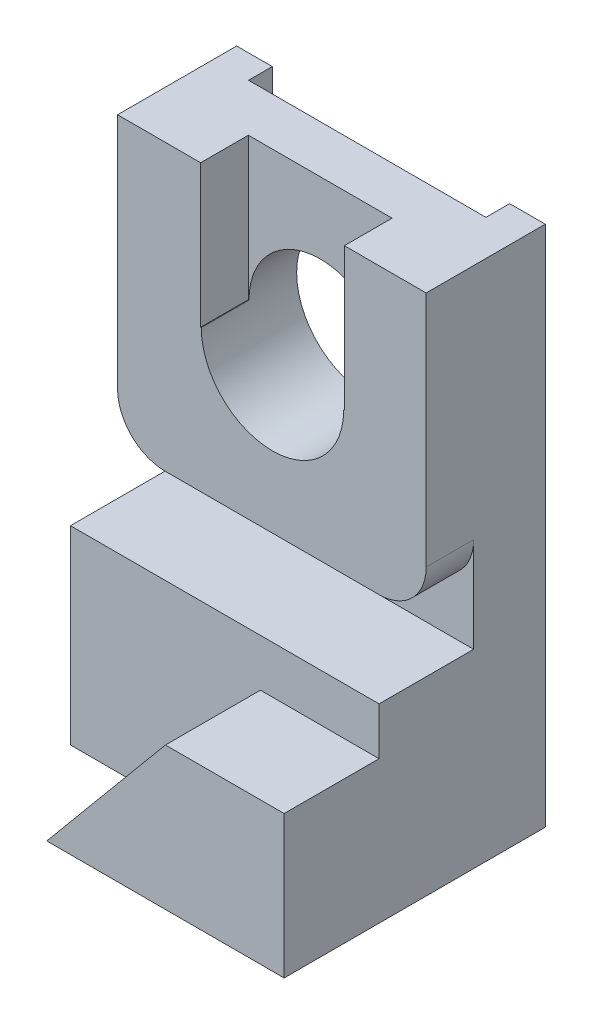
ISO-10303-21;
HEADER;
FILE_DESCRIPTION(('STEP AP214'),'2;1');
FILE_NAME('part.step','',(''),(''),'','','');
FILE_SCHEMA(('AUTOMOTIVE_DESIGN { 1 0 10303 214 1 1 1 1 }'));
ENDSEC;
DATA;
#1=APPLICATION_CONTEXT('core data for automotive mechanical design processes');
#2=APPLICATION_PROTOCOL_DEFINITION('international standard','automotive_design',2000,#1);
#3=PRODUCT_CONTEXT('',#1,'mechanical');
#4=PRODUCT('Part','Part','',(#3));
#5=PRODUCT_RELATED_PRODUCT_CATEGORY('part','',(#4));
#6=PRODUCT_DEFINITION_FORMATION('','',#4);
#7=PRODUCT_DEFINITION_CONTEXT('part definition',#1,'design');
#8=PRODUCT_DEFINITION('design','',#6,#7);
#9=PRODUCT_DEFINITION_SHAPE('','',#8);
#10=(LENGTH_UNIT() NAMED_UNIT(*) SI_UNIT(.MILLI.,.METRE.));
#11=(NAMED_UNIT(*) PLANE_ANGLE_UNIT() SI_UNIT($,.RADIAN.));
#12=(NAMED_UNIT(*) SI_UNIT($,.STERADIAN.) SOLID_ANGLE_UNIT());
#13=UNCERTAINTY_MEASURE_WITH_UNIT(LENGTH_MEASURE(1.E-05),#10,'distance_accuracy_value','');
#14=(GEOMETRIC_REPRESENTATION_CONTEXT(3) GLOBAL_UNCERTAINTY_ASSIGNED_CONTEXT((#13)) GLOBAL_UNIT_ASSIGNED_CONTEXT((#10,
#11,#12)) REPRESENTATION_CONTEXT('',''));
#15=CARTESIAN_POINT('',(0.,0.,0.));
#16=DIRECTION('',(0.,0.,1.));
#17=DIRECTION('',(1.,0.,0.));
#18=AXIS2_PLACEMENT_3D('',#15,#16,#17);
#19=CARTESIAN_POINT('',(0.,160.,0.));
#20=DIRECTION('',(0.,1.,0.));
#21=DIRECTION('',(0.,0.,1.));
#22=AXIS2_PLACEMENT_3D('',#19,#20,#21);
#23=PLANE('',#22);
#24=DIRECTION('',(0.,0.,1.));
#25=VECTOR('',#24,1.);
#26=CARTESIAN_POINT('',(35.2692025075354,160.,-9.83173337084059));
#27=LINE('',#26,#25);
#28=CARTESIAN_POINT('',(35.2692025075354,160.,30.0841333145797));
#29=VERTEX_POINT('',#28);
#30=CARTESIAN_POINT('',(35.2692025075354,160.,50.1682666291594));
#31=VERTEX_POINT('',#30);
#32=EDGE_CURVE('E11',#29,#31,#27,.T.);
#33=ORIENTED_EDGE('',*,*,#32,.F.);
#34=DIRECTION('',(-1.,0.,0.));
#35=VECTOR('',#34,1.);
#36=CARTESIAN_POINT('',(35.,160.,30.0841333145797));
#37=LINE('',#36,#35);
#38=CARTESIAN_POINT('',(35.,160.,30.0841333145797));
#39=VERTEX_POINT('',#38);
#40=EDGE_CURVE('E218',#29,#39,#37,.T.);
#41=ORIENTED_EDGE('',*,*,#40,.T.);
#42=DIRECTION('',(0.,0.,1.));
#43=VECTOR('',#42,1.);
#44=CARTESIAN_POINT('',(35.,160.,30.0841333145797));
#45=LINE('',#44,#43);
#46=CARTESIAN_POINT('',(35.,160.,50.1682666291594));
#47=VERTEX_POINT('',#46);
#48=EDGE_CURVE('E66',#39,#47,#45,.T.);
#49=ORIENTED_EDGE('',*,*,#48,.T.);
#50=DIRECTION('',(1.,0.,0.));
#51=VECTOR('',#50,1.);
#52=CARTESIAN_POINT('',(35.,160.,50.1682666291594));
#53=LINE('',#52,#51);
#54=EDGE_CURVE('E207',#47,#31,#53,.T.);
#55=ORIENTED_EDGE('',*,*,#54,.T.);
#56=EDGE_LOOP('',(#33,#41,#49,#55));
#57=FACE_BOUND('',#56,.T.);
#58=ADVANCED_FACE('F43',(#57),#23,.T.);
#59=CARTESIAN_POINT('',(0.,0.,0.));
#60=DIRECTION('',(0.,0.,-1.));
#61=DIRECTION('',(-1.,0.,0.));
#62=AXIS2_PLACEMENT_3D('',#59,#60,#61);
#63=PLANE('',#62);
#64=DIRECTION('',(0.,1.,0.));
#65=VECTOR('',#64,1.);
#66=CARTESIAN_POINT('',(15.,-40.,0.));
#67=LINE('',#66,#65);
#68=CARTESIAN_POINT('',(15.,0.,0.));
#69=VERTEX_POINT('',#68);
#70=CARTESIAN_POINT('',(15.,220.,0.));
#71=VERTEX_POINT('',#70);
#72=EDGE_CURVE('E268',#69,#71,#67,.T.);
#73=ORIENTED_EDGE('',*,*,#72,.F.);
#74=DIRECTION('',(1.,0.,0.));
#75=VECTOR('',#74,1.);
#76=CARTESIAN_POINT('',(0.,0.,0.));
#77=LINE('',#76,#75);
#78=CARTESIAN_POINT('',(0.,0.,0.));
#79=VERTEX_POINT('',#78);
#80=EDGE_CURVE('E386',#79,#69,#77,.T.);
#81=ORIENTED_EDGE('',*,*,#80,.F.);
#82=DIRECTION('',(0.,-1.,0.));
#83=VECTOR('',#82,1.);
#84=CARTESIAN_POINT('',(0.,0.,0.));
#85=LINE('',#84,#83);
#86=CARTESIAN_POINT('',(0.,220.,0.));
#87=VERTEX_POINT('',#86);
#88=EDGE_CURVE('E366',#87,#79,#85,.T.);
#89=ORIENTED_EDGE('',*,*,#88,.F.);
#90=DIRECTION('',(-1.,0.,0.));
#91=VECTOR('',#90,1.);
#92=CARTESIAN_POINT('',(0.,220.,0.));
#93=LINE('',#92,#91);
#94=EDGE_CURVE('E318',#71,#87,#93,.T.);
#95=ORIENTED_EDGE('',*,*,#94,.F.);
#96=EDGE_LOOP('',(#73,#81,#89,#95));
#97=FACE_BOUND('',#96,.T.);
#98=ADVANCED_FACE('F487',(#97),#63,.T.);
#99=CARTESIAN_POINT('',(0.,220.,30.1682666291594));
#100=DIRECTION('',(0.,0.,-1.));
#101=DIRECTION('',(-1.,0.,0.));
#102=AXIS2_PLACEMENT_3D('',#99,#100,#101);
#103=PLANE('',#102);
#104=DIRECTION('',(1.,0.,0.));
#105=VECTOR('',#104,1.);
#106=CARTESIAN_POINT('',(130.,100.,30.1682666291594));
#107=LINE('',#106,#105);
#108=CARTESIAN_POINT('',(20.,100.,30.1682666291594));
#109=VERTEX_POINT('',#108);
#110=CARTESIAN_POINT('',(110.,100.,30.1682666291594));
#111=VERTEX_POINT('',#110);
#112=EDGE_CURVE('E289',#109,#111,#107,.T.);
#113=ORIENTED_EDGE('',*,*,#112,.F.);
#114=CARTESIAN_POINT('',(20.,120.,30.1682666291594));
#115=DIRECTION('',(0.,0.,-1.));
#116=DIRECTION('',(-1.,0.,0.));
#117=AXIS2_PLACEMENT_3D('',#114,#115,#116);
#118=CIRCLE('',#117,20.);
#119=CARTESIAN_POINT('',(0.,120.,30.1682666291594));
#120=VERTEX_POINT('',#119);
#121=EDGE_CURVE('E417',#109,#120,#118,.T.);
#122=ORIENTED_EDGE('',*,*,#121,.T.);
#123=DIRECTION('',(0.,-1.,0.));
#124=VECTOR('',#123,1.);
#125=CARTESIAN_POINT('',(0.,220.,30.1682666291594));
#126=LINE('',#125,#124);
#127=CARTESIAN_POINT('',(0.,80.,30.1682666291594));
#128=VERTEX_POINT('',#127);
#129=EDGE_CURVE('E329',#120,#128,#126,.T.);
#130=ORIENTED_EDGE('',*,*,#129,.T.);
#131=DIRECTION('',(1.,0.,0.));
#132=VECTOR('',#131,1.);
#133=CARTESIAN_POINT('',(0.,80.,30.1682666291594));
#134=LINE('',#133,#132);
#135=CARTESIAN_POINT('',(130.,80.,30.1682666291594));
#136=VERTEX_POINT('',#135);
#137=EDGE_CURVE('E306',#128,#136,#134,.T.);
#138=ORIENTED_EDGE('',*,*,#137,.T.);
#139=DIRECTION('',(0.,-1.,0.));
#140=VECTOR('',#139,1.);
#141=CARTESIAN_POINT('',(130.,220.,30.1682666291594));
#142=LINE('',#141,#140);
#143=CARTESIAN_POINT('',(130.,120.,30.1682666291594));
#144=VERTEX_POINT('',#143);
#145=EDGE_CURVE('E323',#144,#136,#142,.T.);
#146=ORIENTED_EDGE('',*,*,#145,.F.);
#147=CARTESIAN_POINT('',(110.,120.,30.1682666291594));
#148=DIRECTION('',(0.,0.,-1.));
#149=DIRECTION('',(-1.,0.,0.));
#150=AXIS2_PLACEMENT_3D('',#147,#148,#149);
#151=CIRCLE('',#150,20.);
#152=EDGE_CURVE('E431',#144,#111,#151,.T.);
#153=ORIENTED_EDGE('',*,*,#152,.T.);
#154=EDGE_LOOP('',(#113,#122,#130,#138,#146,#153));
#155=FACE_BOUND('',#154,.T.);
#156=ADVANCED_FACE('F503',(#155),#103,.F.);
#157=CARTESIAN_POINT('',(0.,80.,70.));
#158=DIRECTION('',(0.,-1.,0.));
#159=DIRECTION('',(0.,0.,-1.));
#160=AXIS2_PLACEMENT_3D('',#157,#158,#159);
#161=PLANE('',#160);
#162=ORIENTED_EDGE('',*,*,#137,.F.);
#163=DIRECTION('',(0.,0.,-1.));
#164=VECTOR('',#163,1.);
#165=CARTESIAN_POINT('',(0.,80.,70.));
#166=LINE('',#165,#164);
#167=CARTESIAN_POINT('',(0.,80.,70.));
#168=VERTEX_POINT('',#167);
#169=EDGE_CURVE('E381',#168,#128,#166,.T.);
#170=ORIENTED_EDGE('',*,*,#169,.F.);
#171=DIRECTION('',(-1.,0.,0.));
#172=VECTOR('',#171,1.);
#173=CARTESIAN_POINT('',(0.,80.,70.));
#174=LINE('',#173,#172);
#175=CARTESIAN_POINT('',(130.,80.,70.));
#176=VERTEX_POINT('',#175);
#177=EDGE_CURVE('E378',#176,#168,#174,.T.);
#178=ORIENTED_EDGE('',*,*,#177,.F.);
#179=DIRECTION('',(0.,0.,-1.));
#180=VECTOR('',#179,1.);
#181=CARTESIAN_POINT('',(130.,80.,70.));
#182=LINE('',#181,#180);
#183=EDGE_CURVE('E395',#176,#136,#182,.T.);
#184=ORIENTED_EDGE('',*,*,#183,.T.);
#185=EDGE_LOOP('',(#162,#170,#178,#184));
#186=FACE_BOUND('',#185,.T.);
#187=ADVANCED_FACE('F513',(#186),#161,.F.);
#188=CARTESIAN_POINT('',(0.,0.,70.));
#189=DIRECTION('',(0.,0.,-1.));
#190=DIRECTION('',(-1.,0.,0.));
#191=AXIS2_PLACEMENT_3D('',#188,#189,#190);
#192=PLANE('',#191);
#193=DIRECTION('',(-0.640179639012722,-0.76822524678218,0.));
#194=VECTOR('',#193,1.);
#195=CARTESIAN_POINT('',(80.,60.0007560352066,70.));
#196=LINE('',#195,#194);
#197=CARTESIAN_POINT('',(80.,60.0007560352066,70.));
#198=VERTEX_POINT('',#197);
#199=CARTESIAN_POINT('',(30.,0.,70.));
#200=VERTEX_POINT('',#199);
#201=EDGE_CURVE('E338',#198,#200,#196,.T.);
#202=ORIENTED_EDGE('',*,*,#201,.F.);
#203=DIRECTION('',(-1.,0.,0.));
#204=VECTOR('',#203,1.);
#205=CARTESIAN_POINT('',(130.,60.0007560352066,70.));
#206=LINE('',#205,#204);
#207=CARTESIAN_POINT('',(130.,60.0007560352066,70.));
#208=VERTEX_POINT('',#207);
#209=EDGE_CURVE('E332',#208,#198,#206,.T.);
#210=ORIENTED_EDGE('',*,*,#209,.F.);
#211=DIRECTION('',(0.,1.,0.));
#212=VECTOR('',#211,1.);
#213=CARTESIAN_POINT('',(130.,0.,70.));
#214=LINE('',#213,#212);
#215=EDGE_CURVE('E375',#208,#176,#214,.T.);
#216=ORIENTED_EDGE('',*,*,#215,.T.);
#217=ORIENTED_EDGE('',*,*,#177,.T.);
#218=DIRECTION('',(0.,-1.,0.));
#219=VECTOR('',#218,1.);
#220=CARTESIAN_POINT('',(0.,0.,70.));
#221=LINE('',#220,#219);
#222=CARTESIAN_POINT('',(0.,0.,70.));
#223=VERTEX_POINT('',#222);
#224=EDGE_CURVE('E367',#168,#223,#221,.T.);
#225=ORIENTED_EDGE('',*,*,#224,.T.);
#226=DIRECTION('',(1.,0.,0.));
#227=VECTOR('',#226,1.);
#228=CARTESIAN_POINT('',(0.,0.,70.));
#229=LINE('',#228,#227);
#230=EDGE_CURVE('E371',#223,#200,#229,.T.);
#231=ORIENTED_EDGE('',*,*,#230,.T.);
#232=EDGE_LOOP('',(#202,#210,#216,#217,#225,#231));
#233=FACE_BOUND('',#232,.T.);
#234=ADVANCED_FACE('F517',(#233),#192,.F.);
#235=CARTESIAN_POINT('',(0.,0.,70.));
#236=DIRECTION('',(1.,0.,0.));
#237=DIRECTION('',(0.,0.,-1.));
#238=AXIS2_PLACEMENT_3D('',#235,#236,#237);
#239=PLANE('',#238);
#240=ORIENTED_EDGE('',*,*,#129,.F.);
#241=DIRECTION('',(0.,0.,-1.));
#242=VECTOR('',#241,1.);
#243=CARTESIAN_POINT('',(0.,120.,70.));
#244=LINE('',#243,#242);
#245=CARTESIAN_POINT('',(0.,120.,50.1682666291594));
#246=VERTEX_POINT('',#245);
#247=EDGE_CURVE('E411',#120,#246,#244,.F.);
#248=ORIENTED_EDGE('',*,*,#247,.T.);
#249=DIRECTION('',(0.,-1.,0.));
#250=VECTOR('',#249,1.);
#251=CARTESIAN_POINT('',(0.,220.,50.1682666291594));
#252=LINE('',#251,#250);
#253=CARTESIAN_POINT('',(0.,220.,50.1682666291594));
#254=VERTEX_POINT('',#253);
#255=EDGE_CURVE('E298',#254,#246,#252,.T.);
#256=ORIENTED_EDGE('',*,*,#255,.F.);
#257=DIRECTION('',(0.,0.,1.));
#258=VECTOR('',#257,1.);
#259=CARTESIAN_POINT('',(0.,220.,0.));
#260=LINE('',#259,#258);
#261=EDGE_CURVE('E310',#87,#254,#260,.T.);
#262=ORIENTED_EDGE('',*,*,#261,.F.);
#263=ORIENTED_EDGE('',*,*,#88,.T.);
#264=DIRECTION('',(0.,0.,-1.));
#265=VECTOR('',#264,1.);
#266=CARTESIAN_POINT('',(0.,0.,70.));
#267=LINE('',#266,#265);
#268=EDGE_CURVE('E403',#223,#79,#267,.T.);
#269=ORIENTED_EDGE('',*,*,#268,.F.);
#270=ORIENTED_EDGE('',*,*,#224,.F.);
#271=ORIENTED_EDGE('',*,*,#169,.T.);
#272=EDGE_LOOP('',(#240,#248,#256,#262,#263,#269,#270,#271));
#273=FACE_BOUND('',#272,.T.);
#274=ADVANCED_FACE('F491',(#273),#239,.F.);
#275=CARTESIAN_POINT('',(0.,0.,70.));
#276=DIRECTION('',(0.,1.,0.));
#277=DIRECTION('',(0.,0.,1.));
#278=AXIS2_PLACEMENT_3D('',#275,#276,#277);
#279=PLANE('',#278);
#280=ORIENTED_EDGE('',*,*,#80,.T.);
#281=DIRECTION('',(0.,0.,1.));
#282=VECTOR('',#281,1.);
#283=CARTESIAN_POINT('',(15.,0.,70.));
#284=LINE('',#283,#282);
#285=CARTESIAN_POINT('',(15.,0.,10.));
#286=VERTEX_POINT('',#285);
#287=EDGE_CURVE('E281',#69,#286,#284,.T.);
#288=ORIENTED_EDGE('',*,*,#287,.T.);
#289=DIRECTION('',(1.,0.,0.));
#290=VECTOR('',#289,1.);
#291=CARTESIAN_POINT('',(0.,0.,10.));
#292=LINE('',#291,#290);
#293=CARTESIAN_POINT('',(115.,0.,10.));
#294=VERTEX_POINT('',#293);
#295=EDGE_CURVE('E285',#286,#294,#292,.T.);
#296=ORIENTED_EDGE('',*,*,#295,.T.);
#297=DIRECTION('',(0.,0.,-1.));
#298=VECTOR('',#297,1.);
#299=CARTESIAN_POINT('',(115.,0.,70.));
#300=LINE('',#299,#298);
#301=CARTESIAN_POINT('',(115.,0.,0.));
#302=VERTEX_POINT('',#301);
#303=EDGE_CURVE('E267',#294,#302,#300,.T.);
#304=ORIENTED_EDGE('',*,*,#303,.T.);
#305=CARTESIAN_POINT('',(130.,0.,0.));
#306=VERTEX_POINT('',#305);
#307=EDGE_CURVE('E385',#302,#306,#77,.T.);
#308=ORIENTED_EDGE('',*,*,#307,.T.);
#309=DIRECTION('',(0.,0.,-1.));
#310=VECTOR('',#309,1.);
#311=CARTESIAN_POINT('',(130.,0.,70.));
#312=LINE('',#311,#310);
#313=CARTESIAN_POINT('',(130.,0.,110.));
#314=VERTEX_POINT('',#313);
#315=EDGE_CURVE('E399',#314,#306,#312,.T.);
#316=ORIENTED_EDGE('',*,*,#315,.F.);
#317=DIRECTION('',(1.,0.,0.));
#318=VECTOR('',#317,1.);
#319=CARTESIAN_POINT('',(130.,0.,110.));
#320=LINE('',#319,#318);
#321=CARTESIAN_POINT('',(30.,0.,110.));
#322=VERTEX_POINT('',#321);
#323=EDGE_CURVE('E344',#322,#314,#320,.T.);
#324=ORIENTED_EDGE('',*,*,#323,.F.);
#325=DIRECTION('',(0.,0.,-1.));
#326=VECTOR('',#325,1.);
#327=CARTESIAN_POINT('',(30.,0.,110.));
#328=LINE('',#327,#326);
#329=EDGE_CURVE('E348',#322,#200,#328,.T.);
#330=ORIENTED_EDGE('',*,*,#329,.T.);
#331=ORIENTED_EDGE('',*,*,#230,.F.);
#332=ORIENTED_EDGE('',*,*,#268,.T.);
#333=EDGE_LOOP('',(#280,#288,#296,#304,#308,#316,#324,#330,#331,#332));
#334=FACE_BOUND('',#333,.T.);
#335=ADVANCED_FACE('F464',(#334),#279,.F.);
#336=CARTESIAN_POINT('',(130.,0.,70.));
#337=DIRECTION('',(-1.,0.,0.));
#338=DIRECTION('',(0.,0.,1.));
#339=AXIS2_PLACEMENT_3D('',#336,#337,#338);
#340=PLANE('',#339);
#341=DIRECTION('',(0.,1.,0.));
#342=VECTOR('',#341,1.);
#343=CARTESIAN_POINT('',(130.,220.,50.1682666291594));
#344=LINE('',#343,#342);
#345=CARTESIAN_POINT('',(130.,120.,50.1682666291594));
#346=VERTEX_POINT('',#345);
#347=CARTESIAN_POINT('',(130.,220.,50.1682666291594));
#348=VERTEX_POINT('',#347);
#349=EDGE_CURVE('E290',#346,#348,#344,.T.);
#350=ORIENTED_EDGE('',*,*,#349,.F.);
#351=DIRECTION('',(0.,0.,-1.));
#352=VECTOR('',#351,1.);
#353=CARTESIAN_POINT('',(130.,120.,70.));
#354=LINE('',#353,#352);
#355=EDGE_CURVE('E421',#346,#144,#354,.T.);
#356=ORIENTED_EDGE('',*,*,#355,.T.);
#357=ORIENTED_EDGE('',*,*,#145,.T.);
#358=ORIENTED_EDGE('',*,*,#183,.F.);
#359=ORIENTED_EDGE('',*,*,#215,.F.);
#360=DIRECTION('',(0.,0.,-1.));
#361=VECTOR('',#360,1.);
#362=CARTESIAN_POINT('',(130.,60.0007560352066,110.));
#363=LINE('',#362,#361);
#364=CARTESIAN_POINT('',(130.,60.0007560352066,110.));
#365=VERTEX_POINT('',#364);
#366=EDGE_CURVE('E362',#365,#208,#363,.T.);
#367=ORIENTED_EDGE('',*,*,#366,.F.);
#368=DIRECTION('',(0.,1.,0.));
#369=VECTOR('',#368,1.);
#370=CARTESIAN_POINT('',(130.,0.,110.));
#371=LINE('',#370,#369);
#372=EDGE_CURVE('E333',#314,#365,#371,.T.);
#373=ORIENTED_EDGE('',*,*,#372,.F.);
#374=ORIENTED_EDGE('',*,*,#315,.T.);
#375=DIRECTION('',(0.,1.,0.));
#376=VECTOR('',#375,1.);
#377=CARTESIAN_POINT('',(130.,0.,0.));
#378=LINE('',#377,#376);
#379=CARTESIAN_POINT('',(130.,220.,0.));
#380=VERTEX_POINT('',#379);
#381=EDGE_CURVE('E372',#306,#380,#378,.T.);
#382=ORIENTED_EDGE('',*,*,#381,.T.);
#383=DIRECTION('',(0.,0.,-1.));
#384=VECTOR('',#383,1.);
#385=CARTESIAN_POINT('',(130.,220.,0.));
#386=LINE('',#385,#384);
#387=EDGE_CURVE('E314',#348,#380,#386,.T.);
#388=ORIENTED_EDGE('',*,*,#387,.F.);
#389=EDGE_LOOP('',(#350,#356,#357,#358,#359,#367,#373,#374,#382,#388));
#390=FACE_BOUND('',#389,.T.);
#391=ADVANCED_FACE('F470',(#390),#340,.F.);
#392=DIRECTION('',(0.,1.,0.));
#393=VECTOR('',#392,1.);
#394=CARTESIAN_POINT('',(115.,-40.,0.));
#395=LINE('',#394,#393);
#396=CARTESIAN_POINT('',(115.,220.,0.));
#397=VERTEX_POINT('',#396);
#398=EDGE_CURVE('E271',#302,#397,#395,.T.);
#399=ORIENTED_EDGE('',*,*,#398,.T.);
#400=EDGE_CURVE('E319',#380,#397,#93,.T.);
#401=ORIENTED_EDGE('',*,*,#400,.F.);
#402=ORIENTED_EDGE('',*,*,#381,.F.);
#403=ORIENTED_EDGE('',*,*,#307,.F.);
#404=EDGE_LOOP('',(#399,#401,#402,#403));
#405=FACE_BOUND('',#404,.T.);
#406=ADVANCED_FACE('F472',(#405),#63,.T.);
#407=CARTESIAN_POINT('',(130.,60.0007560352066,110.));
#408=DIRECTION('',(0.,-1.,0.));
#409=DIRECTION('',(0.,0.,-1.));
#410=AXIS2_PLACEMENT_3D('',#407,#408,#409);
#411=PLANE('',#410);
#412=ORIENTED_EDGE('',*,*,#209,.T.);
#413=DIRECTION('',(0.,0.,-1.));
#414=VECTOR('',#413,1.);
#415=CARTESIAN_POINT('',(80.,60.0007560352066,110.));
#416=LINE('',#415,#414);
#417=CARTESIAN_POINT('',(80.,60.0007560352066,110.));
#418=VERTEX_POINT('',#417);
#419=EDGE_CURVE('E358',#418,#198,#416,.T.);
#420=ORIENTED_EDGE('',*,*,#419,.F.);
#421=DIRECTION('',(-1.,0.,0.));
#422=VECTOR('',#421,1.);
#423=CARTESIAN_POINT('',(130.,60.0007560352066,110.));
#424=LINE('',#423,#422);
#425=EDGE_CURVE('E337',#365,#418,#424,.T.);
#426=ORIENTED_EDGE('',*,*,#425,.F.);
#427=ORIENTED_EDGE('',*,*,#366,.T.);
#428=EDGE_LOOP('',(#412,#420,#426,#427));
#429=FACE_BOUND('',#428,.T.);
#430=ADVANCED_FACE('F519',(#429),#411,.F.);
#431=CARTESIAN_POINT('',(80.,60.0007560352066,110.));
#432=DIRECTION('',(0.76822524678218,-0.640179639012722,0.));
#433=DIRECTION('',(0.640179639012722,0.76822524678218,0.));
#434=AXIS2_PLACEMENT_3D('',#431,#432,#433);
#435=PLANE('',#434);
#436=ORIENTED_EDGE('',*,*,#201,.T.);
#437=ORIENTED_EDGE('',*,*,#329,.F.);
#438=DIRECTION('',(-0.640179639012722,-0.76822524678218,0.));
#439=VECTOR('',#438,1.);
#440=CARTESIAN_POINT('',(80.,60.0007560352066,110.));
#441=LINE('',#440,#439);
#442=EDGE_CURVE('E341',#418,#322,#441,.T.);
#443=ORIENTED_EDGE('',*,*,#442,.F.);
#444=ORIENTED_EDGE('',*,*,#419,.T.);
#445=EDGE_LOOP('',(#436,#437,#443,#444));
#446=FACE_BOUND('',#445,.T.);
#447=ADVANCED_FACE('F526',(#446),#435,.F.);
#448=CARTESIAN_POINT('',(0.,0.,110.));
#449=DIRECTION('',(0.,0.,1.));
#450=DIRECTION('',(1.,0.,0.));
#451=AXIS2_PLACEMENT_3D('',#448,#449,#450);
#452=PLANE('',#451);
#453=ORIENTED_EDGE('',*,*,#372,.T.);
#454=ORIENTED_EDGE('',*,*,#425,.T.);
#455=ORIENTED_EDGE('',*,*,#442,.T.);
#456=ORIENTED_EDGE('',*,*,#323,.T.);
#457=EDGE_LOOP('',(#453,#454,#455,#456));
#458=FACE_BOUND('',#457,.T.);
#459=ADVANCED_FACE('F523',(#458),#452,.T.);
#460=CARTESIAN_POINT('',(0.,220.,0.));
#461=DIRECTION('',(0.,1.,0.));
#462=DIRECTION('',(0.,0.,1.));
#463=AXIS2_PLACEMENT_3D('',#460,#461,#462);
#464=PLANE('',#463);
#465=DIRECTION('',(0.,0.,1.));
#466=VECTOR('',#465,1.);
#467=CARTESIAN_POINT('',(35.,220.,30.0841333145797));
#468=LINE('',#467,#466);
#469=CARTESIAN_POINT('',(35.,220.,30.0841333145797));
#470=VERTEX_POINT('',#469);
#471=CARTESIAN_POINT('',(35.,220.,50.1682666291594));
#472=VERTEX_POINT('',#471);
#473=EDGE_CURVE('E220',#470,#472,#468,.T.);
#474=ORIENTED_EDGE('',*,*,#473,.F.);
#475=DIRECTION('',(-1.,0.,0.));
#476=VECTOR('',#475,1.);
#477=CARTESIAN_POINT('',(35.,220.,30.0841333145797));
#478=LINE('',#477,#476);
#479=CARTESIAN_POINT('',(95.5384050150707,220.,30.0841333145797));
#480=VERTEX_POINT('',#479);
#481=EDGE_CURVE('E236',#480,#470,#478,.T.);
#482=ORIENTED_EDGE('',*,*,#481,.F.);
#483=DIRECTION('',(0.,0.,-1.));
#484=VECTOR('',#483,1.);
#485=CARTESIAN_POINT('',(95.5384050150707,220.,50.1682666291594));
#486=LINE('',#485,#484);
#487=CARTESIAN_POINT('',(95.5384050150707,220.,50.1682666291594));
#488=VERTEX_POINT('',#487);
#489=EDGE_CURVE('E232',#488,#480,#486,.T.);
#490=ORIENTED_EDGE('',*,*,#489,.F.);
#491=DIRECTION('',(-1.,0.,0.));
#492=VECTOR('',#491,1.);
#493=CARTESIAN_POINT('',(130.,220.,50.1682666291594));
#494=LINE('',#493,#492);
#495=EDGE_CURVE('E294',#348,#488,#494,.T.);
#496=ORIENTED_EDGE('',*,*,#495,.F.);
#497=ORIENTED_EDGE('',*,*,#387,.T.);
#498=ORIENTED_EDGE('',*,*,#400,.T.);
#499=DIRECTION('',(0.,0.,-1.));
#500=VECTOR('',#499,1.);
#501=CARTESIAN_POINT('',(115.,220.,0.));
#502=LINE('',#501,#500);
#503=CARTESIAN_POINT('',(115.,220.,10.));
#504=VERTEX_POINT('',#503);
#505=EDGE_CURVE('E256',#504,#397,#502,.T.);
#506=ORIENTED_EDGE('',*,*,#505,.F.);
#507=DIRECTION('',(1.,0.,0.));
#508=VECTOR('',#507,1.);
#509=CARTESIAN_POINT('',(15.,220.,10.));
#510=LINE('',#509,#508);
#511=CARTESIAN_POINT('',(15.,220.,10.));
#512=VERTEX_POINT('',#511);
#513=EDGE_CURVE('E245',#512,#504,#510,.T.);
#514=ORIENTED_EDGE('',*,*,#513,.F.);
#515=DIRECTION('',(0.,0.,1.));
#516=VECTOR('',#515,1.);
#517=CARTESIAN_POINT('',(15.,220.,0.));
#518=LINE('',#517,#516);
#519=EDGE_CURVE('E259',#71,#512,#518,.T.);
#520=ORIENTED_EDGE('',*,*,#519,.F.);
#521=ORIENTED_EDGE('',*,*,#94,.T.);
#522=ORIENTED_EDGE('',*,*,#261,.T.);
#523=EDGE_CURVE('E293',#472,#254,#494,.T.);
#524=ORIENTED_EDGE('',*,*,#523,.F.);
#525=EDGE_LOOP('',(#474,#482,#490,#496,#497,#498,#506,#514,#520,#521,#522,#524));
#526=FACE_BOUND('',#525,.T.);
#527=ADVANCED_FACE('F450',(#526),#464,.T.);
#528=CARTESIAN_POINT('',(130.,100.,50.1682666291594));
#529=DIRECTION('',(0.,1.,0.));
#530=DIRECTION('',(-1.,0.,0.));
#531=AXIS2_PLACEMENT_3D('',#528,#529,#530);
#532=PLANE('',#531);
#533=ORIENTED_EDGE('',*,*,#112,.T.);
#534=DIRECTION('',(0.,0.,-1.));
#535=VECTOR('',#534,1.);
#536=CARTESIAN_POINT('',(110.,100.,50.1682666291594));
#537=LINE('',#536,#535);
#538=CARTESIAN_POINT('',(110.,100.,50.1682666291594));
#539=VERTEX_POINT('',#538);
#540=EDGE_CURVE('E425',#111,#539,#537,.F.);
#541=ORIENTED_EDGE('',*,*,#540,.T.);
#542=DIRECTION('',(1.,0.,0.));
#543=VECTOR('',#542,1.);
#544=CARTESIAN_POINT('',(130.,100.,50.1682666291594));
#545=LINE('',#544,#543);
#546=CARTESIAN_POINT('',(20.,100.,50.1682666291594));
#547=VERTEX_POINT('',#546);
#548=EDGE_CURVE('E302',#547,#539,#545,.T.);
#549=ORIENTED_EDGE('',*,*,#548,.F.);
#550=DIRECTION('',(0.,0.,-1.));
#551=VECTOR('',#550,1.);
#552=CARTESIAN_POINT('',(20.,100.,50.1682666291594));
#553=LINE('',#552,#551);
#554=EDGE_CURVE('E407',#547,#109,#553,.T.);
#555=ORIENTED_EDGE('',*,*,#554,.T.);
#556=EDGE_LOOP('',(#533,#541,#549,#555));
#557=FACE_BOUND('',#556,.T.);
#558=ADVANCED_FACE('F500',(#557),#532,.F.);
#559=CARTESIAN_POINT('',(0.,0.,50.1682666291594));
#560=DIRECTION('',(0.,0.,-1.));
#561=DIRECTION('',(-1.,0.,0.));
#562=AXIS2_PLACEMENT_3D('',#559,#560,#561);
#563=PLANE('',#562);
#564=CARTESIAN_POINT('',(95.2692025075354,160.,50.1682666291594));
#565=VERTEX_POINT('',#564);
#566=CARTESIAN_POINT('',(95.5384050150707,160.,50.1682666291594));
#567=VERTEX_POINT('',#566);
#568=EDGE_CURVE('E209',#565,#567,#53,.T.);
#569=ORIENTED_EDGE('',*,*,#568,.F.);
#570=CARTESIAN_POINT('',(65.2692025075354,160.,50.1682666291594));
#571=DIRECTION('',(0.,0.,1.));
#572=DIRECTION('',(1.,0.,0.));
#573=AXIS2_PLACEMENT_3D('',#570,#571,#572);
#574=CIRCLE('',#573,30.);
#575=EDGE_CURVE('E58',#31,#565,#574,.T.);
#576=ORIENTED_EDGE('',*,*,#575,.F.);
#577=ORIENTED_EDGE('',*,*,#54,.F.);
#578=DIRECTION('',(0.,1.,0.));
#579=VECTOR('',#578,1.);
#580=CARTESIAN_POINT('',(35.,160.,50.1682666291594));
#581=LINE('',#580,#579);
#582=EDGE_CURVE('E242',#47,#472,#581,.T.);
#583=ORIENTED_EDGE('',*,*,#582,.T.);
#584=ORIENTED_EDGE('',*,*,#523,.T.);
#585=ORIENTED_EDGE('',*,*,#255,.T.);
#586=CARTESIAN_POINT('',(20.,120.,50.1682666291594));
#587=DIRECTION('',(0.,0.,-1.));
#588=DIRECTION('',(-1.,0.,0.));
#589=AXIS2_PLACEMENT_3D('',#586,#587,#588);
#590=CIRCLE('',#589,20.);
#591=EDGE_CURVE('E414',#246,#547,#590,.F.);
#592=ORIENTED_EDGE('',*,*,#591,.T.);
#593=ORIENTED_EDGE('',*,*,#548,.T.);
#594=CARTESIAN_POINT('',(110.,120.,50.1682666291594));
#595=DIRECTION('',(0.,0.,-1.));
#596=DIRECTION('',(-1.,0.,0.));
#597=AXIS2_PLACEMENT_3D('',#594,#595,#596);
#598=CIRCLE('',#597,20.);
#599=EDGE_CURVE('E428',#539,#346,#598,.F.);
#600=ORIENTED_EDGE('',*,*,#599,.T.);
#601=ORIENTED_EDGE('',*,*,#349,.T.);
#602=ORIENTED_EDGE('',*,*,#495,.T.);
#603=DIRECTION('',(0.,1.,0.));
#604=VECTOR('',#603,1.);
#605=CARTESIAN_POINT('',(95.5384050150707,160.,50.1682666291594));
#606=LINE('',#605,#604);
#607=EDGE_CURVE('E231',#567,#488,#606,.T.);
#608=ORIENTED_EDGE('',*,*,#607,.F.);
#609=EDGE_LOOP('',(#569,#576,#577,#583,#584,#585,#592,#593,#600,#601,#602,#608));
#610=FACE_BOUND('',#609,.T.);
#611=ADVANCED_FACE('F205',(#610),#563,.F.);
#612=CARTESIAN_POINT('',(15.,-40.,10.));
#613=DIRECTION('',(0.,0.,1.));
#614=DIRECTION('',(1.,0.,0.));
#615=AXIS2_PLACEMENT_3D('',#612,#613,#614);
#616=PLANE('',#615);
#617=CARTESIAN_POINT('',(65.2692025075354,160.,10.));
#618=DIRECTION('',(0.,0.,1.));
#619=DIRECTION('',(1.,0.,0.));
#620=AXIS2_PLACEMENT_3D('',#617,#618,#619);
#621=CIRCLE('',#620,30.);
#622=CARTESIAN_POINT('',(95.2692025075354,160.,10.));
#623=VERTEX_POINT('',#622);
#624=EDGE_CURVE('E222',#623,#623,#621,.T.);
#625=ORIENTED_EDGE('',*,*,#624,.T.);
#626=EDGE_LOOP('',(#625));
#627=FACE_BOUND('',#626,.T.);
#628=DIRECTION('',(0.,1.,0.));
#629=VECTOR('',#628,1.);
#630=CARTESIAN_POINT('',(15.,-40.,10.));
#631=LINE('',#630,#629);
#632=EDGE_CURVE('E264',#286,#512,#631,.T.);
#633=ORIENTED_EDGE('',*,*,#632,.T.);
#634=ORIENTED_EDGE('',*,*,#513,.T.);
#635=DIRECTION('',(0.,1.,0.));
#636=VECTOR('',#635,1.);
#637=CARTESIAN_POINT('',(115.,-40.,10.));
#638=LINE('',#637,#636);
#639=EDGE_CURVE('E263',#294,#504,#638,.T.);
#640=ORIENTED_EDGE('',*,*,#639,.F.);
#641=ORIENTED_EDGE('',*,*,#295,.F.);
#642=EDGE_LOOP('',(#633,#634,#640,#641));
#643=FACE_BOUND('',#642,.T.);
#644=ADVANCED_FACE('F480',(#627,#643),#616,.F.);
#645=CARTESIAN_POINT('',(15.,-40.,0.));
#646=DIRECTION('',(-1.,0.,0.));
#647=DIRECTION('',(0.,0.,1.));
#648=AXIS2_PLACEMENT_3D('',#645,#646,#647);
#649=PLANE('',#648);
#650=ORIENTED_EDGE('',*,*,#72,.T.);
#651=ORIENTED_EDGE('',*,*,#519,.T.);
#652=ORIENTED_EDGE('',*,*,#632,.F.);
#653=ORIENTED_EDGE('',*,*,#287,.F.);
#654=EDGE_LOOP('',(#650,#651,#652,#653));
#655=FACE_BOUND('',#654,.T.);
#656=ADVANCED_FACE('F484',(#655),#649,.F.);
#657=CARTESIAN_POINT('',(115.,-40.,0.));
#658=DIRECTION('',(1.,0.,0.));
#659=DIRECTION('',(0.,0.,-1.));
#660=AXIS2_PLACEMENT_3D('',#657,#658,#659);
#661=PLANE('',#660);
#662=ORIENTED_EDGE('',*,*,#639,.T.);
#663=ORIENTED_EDGE('',*,*,#505,.T.);
#664=ORIENTED_EDGE('',*,*,#398,.F.);
#665=ORIENTED_EDGE('',*,*,#303,.F.);
#666=EDGE_LOOP('',(#662,#663,#664,#665));
#667=FACE_BOUND('',#666,.T.);
#668=ADVANCED_FACE('F477',(#667),#661,.F.);
#669=CARTESIAN_POINT('',(20.,120.,50.1682666291594));
#670=DIRECTION('',(0.,0.,-1.));
#671=DIRECTION('',(-1.,0.,0.));
#672=AXIS2_PLACEMENT_3D('',#669,#670,#671);
#673=CYLINDRICAL_SURFACE('',#672,20.);
#674=ORIENTED_EDGE('',*,*,#591,.F.);
#675=ORIENTED_EDGE('',*,*,#247,.F.);
#676=ORIENTED_EDGE('',*,*,#121,.F.);
#677=ORIENTED_EDGE('',*,*,#554,.F.);
#678=EDGE_LOOP('',(#674,#675,#676,#677));
#679=FACE_BOUND('',#678,.T.);
#680=ADVANCED_FACE('F497',(#679),#673,.T.);
#681=CARTESIAN_POINT('',(110.,120.,70.));
#682=DIRECTION('',(0.,0.,-1.));
#683=DIRECTION('',(-1.,0.,0.));
#684=AXIS2_PLACEMENT_3D('',#681,#682,#683);
#685=CYLINDRICAL_SURFACE('',#684,20.);
#686=ORIENTED_EDGE('',*,*,#599,.F.);
#687=ORIENTED_EDGE('',*,*,#540,.F.);
#688=ORIENTED_EDGE('',*,*,#152,.F.);
#689=ORIENTED_EDGE('',*,*,#355,.F.);
#690=EDGE_LOOP('',(#686,#687,#688,#689));
#691=FACE_BOUND('',#690,.T.);
#692=ADVANCED_FACE('F45',(#691),#685,.T.);
#693=CARTESIAN_POINT('',(35.,160.,30.0841333145797));
#694=DIRECTION('',(-1.,0.,0.));
#695=DIRECTION('',(0.,0.,1.));
#696=AXIS2_PLACEMENT_3D('',#693,#694,#695);
#697=PLANE('',#696);
#698=ORIENTED_EDGE('',*,*,#473,.T.);
#699=ORIENTED_EDGE('',*,*,#582,.F.);
#700=ORIENTED_EDGE('',*,*,#48,.F.);
#701=DIRECTION('',(0.,1.,0.));
#702=VECTOR('',#701,1.);
#703=CARTESIAN_POINT('',(35.,160.,30.0841333145797));
#704=LINE('',#703,#702);
#705=EDGE_CURVE('E246',#39,#470,#704,.T.);
#706=ORIENTED_EDGE('',*,*,#705,.T.);
#707=EDGE_LOOP('',(#698,#699,#700,#706));
#708=FACE_BOUND('',#707,.T.);
#709=ADVANCED_FACE('F455',(#708),#697,.F.);
#710=CARTESIAN_POINT('',(35.,160.,30.0841333145797));
#711=DIRECTION('',(0.,0.,-1.));
#712=DIRECTION('',(-1.,0.,0.));
#713=AXIS2_PLACEMENT_3D('',#710,#711,#712);
#714=PLANE('',#713);
#715=ORIENTED_EDGE('',*,*,#40,.F.);
#716=CARTESIAN_POINT('',(65.2692025075354,160.,30.0841333145797));
#717=DIRECTION('',(0.,0.,-1.));
#718=DIRECTION('',(-1.,0.,0.));
#719=AXIS2_PLACEMENT_3D('',#716,#717,#718);
#720=CIRCLE('',#719,30.);
#721=CARTESIAN_POINT('',(95.2692025075354,160.,30.0841333145797));
#722=VERTEX_POINT('',#721);
#723=EDGE_CURVE('E200',#29,#722,#720,.T.);
#724=ORIENTED_EDGE('',*,*,#723,.T.);
#725=CARTESIAN_POINT('',(95.5384050150707,160.,30.0841333145797));
#726=VERTEX_POINT('',#725);
#727=EDGE_CURVE('E225',#726,#722,#37,.T.);
#728=ORIENTED_EDGE('',*,*,#727,.F.);
#729=DIRECTION('',(0.,1.,0.));
#730=VECTOR('',#729,1.);
#731=CARTESIAN_POINT('',(95.5384050150707,160.,30.0841333145797));
#732=LINE('',#731,#730);
#733=EDGE_CURVE('E249',#726,#480,#732,.T.);
#734=ORIENTED_EDGE('',*,*,#733,.T.);
#735=ORIENTED_EDGE('',*,*,#481,.T.);
#736=ORIENTED_EDGE('',*,*,#705,.F.);
#737=EDGE_LOOP('',(#715,#724,#728,#734,#735,#736));
#738=FACE_BOUND('',#737,.T.);
#739=ADVANCED_FACE('F437',(#738),#714,.F.);
#740=CARTESIAN_POINT('',(95.5384050150707,160.,50.1682666291594));
#741=DIRECTION('',(1.,0.,0.));
#742=DIRECTION('',(0.,0.,-1.));
#743=AXIS2_PLACEMENT_3D('',#740,#741,#742);
#744=PLANE('',#743);
#745=ORIENTED_EDGE('',*,*,#489,.T.);
#746=ORIENTED_EDGE('',*,*,#733,.F.);
#747=DIRECTION('',(0.,0.,-1.));
#748=VECTOR('',#747,1.);
#749=CARTESIAN_POINT('',(95.5384050150707,160.,50.1682666291594));
#750=LINE('',#749,#748);
#751=EDGE_CURVE('E213',#567,#726,#750,.T.);
#752=ORIENTED_EDGE('',*,*,#751,.F.);
#753=ORIENTED_EDGE('',*,*,#607,.T.);
#754=EDGE_LOOP('',(#745,#746,#752,#753));
#755=FACE_BOUND('',#754,.T.);
#756=ADVANCED_FACE('F443',(#755),#744,.F.);
#757=DIRECTION('',(0.,0.,1.));
#758=VECTOR('',#757,1.);
#759=CARTESIAN_POINT('',(95.2692025075354,160.,-9.83173337084059));
#760=LINE('',#759,#758);
#761=EDGE_CURVE('E52',#565,#722,#760,.F.);
#762=ORIENTED_EDGE('',*,*,#761,.F.);
#763=ORIENTED_EDGE('',*,*,#568,.T.);
#764=ORIENTED_EDGE('',*,*,#751,.T.);
#765=ORIENTED_EDGE('',*,*,#727,.T.);
#766=EDGE_LOOP('',(#762,#763,#764,#765));
#767=FACE_BOUND('',#766,.T.);
#768=ADVANCED_FACE('F440',(#767),#23,.T.);
#769=CARTESIAN_POINT('',(65.2692025075354,160.,-9.83173337084059));
#770=DIRECTION('',(0.,0.,1.));
#771=DIRECTION('',(1.,0.,0.));
#772=AXIS2_PLACEMENT_3D('',#769,#770,#771);
#773=CYLINDRICAL_SURFACE('',#772,30.);
#774=ORIENTED_EDGE('',*,*,#32,.T.);
#775=ORIENTED_EDGE('',*,*,#575,.T.);
#776=ORIENTED_EDGE('',*,*,#761,.T.);
#777=ORIENTED_EDGE('',*,*,#723,.F.);
#778=EDGE_LOOP('',(#774,#775,#776,#777));
#779=FACE_BOUND('',#778,.T.);
#780=ORIENTED_EDGE('',*,*,#624,.F.);
#781=EDGE_LOOP('',(#780));
#782=FACE_BOUND('',#781,.T.);
#783=ADVANCED_FACE('F197',(#779,#782),#773,.F.);
#784=CLOSED_SHELL('',(#58,#98,#156,#187,#234,#274,#335,#391,#406,#430,#447,#459,#527,#558,#611,
#644,#656,#668,#680,#692,#709,#739,#756,#768,#783));
#785=MANIFOLD_SOLID_BREP('B2',#784);
#786=ADVANCED_BREP_SHAPE_REPRESENTATION('',(#18,#785),#14);
#787=SHAPE_DEFINITION_REPRESENTATION(#9,#786);
ENDSEC;
END-ISO-10303-21;
